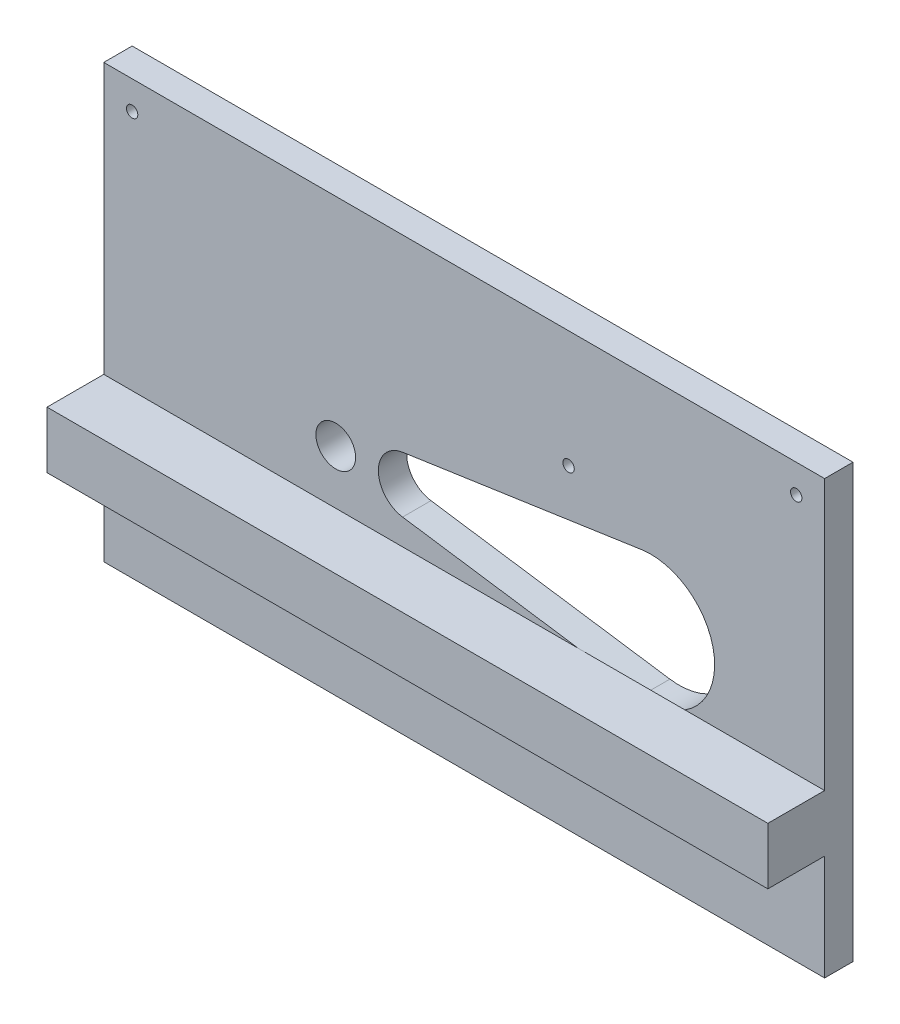
ISO-10303-21;
HEADER;
FILE_DESCRIPTION(('STEP AP214'),'2;1');
FILE_NAME('part.step','',(''),(''),'','','');
FILE_SCHEMA(('AUTOMOTIVE_DESIGN { 1 0 10303 214 1 1 1 1 }'));
ENDSEC;
DATA;
#1=APPLICATION_CONTEXT('core data for automotive mechanical design processes');
#2=APPLICATION_PROTOCOL_DEFINITION('international standard','automotive_design',2000,#1);
#3=PRODUCT_CONTEXT('',#1,'mechanical');
#4=PRODUCT('Part','Part','',(#3));
#5=PRODUCT_RELATED_PRODUCT_CATEGORY('part','',(#4));
#6=PRODUCT_DEFINITION_FORMATION('','',#4);
#7=PRODUCT_DEFINITION_CONTEXT('part definition',#1,'design');
#8=PRODUCT_DEFINITION('design','',#6,#7);
#9=PRODUCT_DEFINITION_SHAPE('','',#8);
#10=(LENGTH_UNIT() NAMED_UNIT(*) SI_UNIT(.MILLI.,.METRE.));
#11=(NAMED_UNIT(*) PLANE_ANGLE_UNIT() SI_UNIT($,.RADIAN.));
#12=(NAMED_UNIT(*) SI_UNIT($,.STERADIAN.) SOLID_ANGLE_UNIT());
#13=UNCERTAINTY_MEASURE_WITH_UNIT(LENGTH_MEASURE(1.E-05),#10,'distance_accuracy_value','');
#14=(GEOMETRIC_REPRESENTATION_CONTEXT(3) GLOBAL_UNCERTAINTY_ASSIGNED_CONTEXT((#13)) GLOBAL_UNIT_ASSIGNED_CONTEXT((#10,
#11,#12)) REPRESENTATION_CONTEXT('',''));
#15=CARTESIAN_POINT('',(0.,0.,0.));
#16=DIRECTION('',(0.,0.,1.));
#17=DIRECTION('',(1.,0.,0.));
#18=AXIS2_PLACEMENT_3D('',#15,#16,#17);
#19=CARTESIAN_POINT('',(0.,0.,10.));
#20=DIRECTION('',(0.,0.,1.));
#21=DIRECTION('',(1.,0.,0.));
#22=AXIS2_PLACEMENT_3D('',#19,#20,#21);
#23=PLANE('',#22);
#24=DIRECTION('',(-1.,0.,0.));
#25=VECTOR('',#24,1.);
#26=CARTESIAN_POINT('',(-125.064497653583,-65.0000000000004,10.));
#27=LINE('',#26,#25);
#28=CARTESIAN_POINT('',(128.935502346417,-65.0000000000004,10.));
#29=VERTEX_POINT('',#28);
#30=CARTESIAN_POINT('',(79.7374731396115,-65.0000000000004,10.));
#31=VERTEX_POINT('',#30);
#32=EDGE_CURVE('E50',#29,#31,#27,.T.);
#33=ORIENTED_EDGE('',*,*,#32,.F.);
#34=DIRECTION('',(0.,-1.,0.));
#35=VECTOR('',#34,1.);
#36=CARTESIAN_POINT('',(128.935502346417,0.,10.));
#37=LINE('',#36,#35);
#38=CARTESIAN_POINT('',(128.935502346417,30.1999999999996,10.));
#39=VERTEX_POINT('',#38);
#40=EDGE_CURVE('E205',#39,#29,#37,.T.);
#41=ORIENTED_EDGE('',*,*,#40,.F.);
#42=DIRECTION('',(1.,0.,0.));
#43=VECTOR('',#42,1.);
#44=CARTESIAN_POINT('',(0.,30.1999999999996,10.));
#45=LINE('',#44,#43);
#46=CARTESIAN_POINT('',(-125.064497653583,30.1999999999996,10.));
#47=VERTEX_POINT('',#46);
#48=EDGE_CURVE('E208',#47,#39,#45,.T.);
#49=ORIENTED_EDGE('',*,*,#48,.F.);
#50=DIRECTION('',(0.,-1.,0.));
#51=VECTOR('',#50,1.);
#52=CARTESIAN_POINT('',(-125.064497653583,0.,10.));
#53=LINE('',#52,#51);
#54=CARTESIAN_POINT('',(-125.064497653583,-65.0000000000004,10.));
#55=VERTEX_POINT('',#54);
#56=EDGE_CURVE('E66',#47,#55,#53,.T.);
#57=ORIENTED_EDGE('',*,*,#56,.T.);
#58=CARTESIAN_POINT('',(42.2173174577816,-65.0000000000004,10.));
#59=VERTEX_POINT('',#58);
#60=EDGE_CURVE('E11',#59,#55,#27,.T.);
#61=ORIENTED_EDGE('',*,*,#60,.F.);
#62=DIRECTION('',(-0.989380470558169,0.145348837209302,0.));
#63=VECTOR('',#62,1.);
#64=CARTESIAN_POINT('',(-8.4554495034443,-57.5557174664701,10.));
#65=LINE('',#64,#63);
#66=CARTESIAN_POINT('',(-19.7679860256755,-55.8938047055821,10.));
#67=VERTEX_POINT('',#66);
#68=EDGE_CURVE('E197',#59,#67,#65,.T.);
#69=ORIENTED_EDGE('',*,*,#68,.T.);
#70=CARTESIAN_POINT('',(-18.3144976535824,-46.0000000000004,10.));
#71=DIRECTION('',(0.,0.,1.));
#72=DIRECTION('',(1.,0.,0.));
#73=AXIS2_PLACEMENT_3D('',#70,#71,#72);
#74=CIRCLE('',#73,10.);
#75=CARTESIAN_POINT('',(-19.7679860256755,-36.1061952944187,10.));
#76=VERTEX_POINT('',#75);
#77=EDGE_CURVE('E186',#76,#67,#74,.T.);
#78=ORIENTED_EDGE('',*,*,#77,.F.);
#79=DIRECTION('',(-0.989380470558169,-0.145348837209302,0.));
#80=VECTOR('',#79,1.);
#81=CARTESIAN_POINT('',(4.77463818425225,-32.5006643615458,10.));
#82=LINE('',#81,#80);
#83=CARTESIAN_POINT('',(64.4151535092082,-23.7389394124416,10.));
#84=VERTEX_POINT('',#83);
#85=EDGE_CURVE('E190',#84,#76,#82,.T.);
#86=ORIENTED_EDGE('',*,*,#85,.F.);
#87=CARTESIAN_POINT('',(67.6855023464175,-46.0000000000004,10.));
#88=DIRECTION('',(0.,0.,1.));
#89=DIRECTION('',(1.,0.,0.));
#90=AXIS2_PLACEMENT_3D('',#87,#88,#89);
#91=CIRCLE('',#90,22.5);
#92=EDGE_CURVE('E193',#31,#84,#91,.T.);
#93=ORIENTED_EDGE('',*,*,#92,.F.);
#94=EDGE_LOOP('',(#33,#41,#49,#57,#61,#69,#78,#86,#93));
#95=FACE_BOUND('',#94,.T.);
#96=CARTESIAN_POINT('',(-115.064497653583,20.1999999999996,10.));
#97=DIRECTION('',(0.,0.,1.));
#98=DIRECTION('',(1.,0.,0.));
#99=AXIS2_PLACEMENT_3D('',#96,#97,#98);
#100=CIRCLE('',#99,2.);
#101=CARTESIAN_POINT('',(-113.064497653583,20.1999999999996,10.));
#102=VERTEX_POINT('',#101);
#103=EDGE_CURVE('E175',#102,#102,#100,.T.);
#104=ORIENTED_EDGE('',*,*,#103,.F.);
#105=EDGE_LOOP('',(#104));
#106=FACE_BOUND('',#105,.T.);
#107=CARTESIAN_POINT('',(118.935502346418,20.1999999999996,10.));
#108=DIRECTION('',(0.,0.,1.));
#109=DIRECTION('',(-1.,0.,0.));
#110=AXIS2_PLACEMENT_3D('',#107,#108,#109);
#111=CIRCLE('',#110,2.);
#112=CARTESIAN_POINT('',(116.935502346418,20.1999999999996,10.));
#113=VERTEX_POINT('',#112);
#114=EDGE_CURVE('E178',#113,#113,#111,.T.);
#115=ORIENTED_EDGE('',*,*,#114,.F.);
#116=EDGE_LOOP('',(#115));
#117=FACE_BOUND('',#116,.T.);
#118=CARTESIAN_POINT('',(38.7255023464175,-11.0000000000004,10.));
#119=DIRECTION('',(0.,0.,1.));
#120=DIRECTION('',(1.,0.,0.));
#121=AXIS2_PLACEMENT_3D('',#118,#119,#120);
#122=CIRCLE('',#121,2.);
#123=CARTESIAN_POINT('',(40.7255023464175,-11.0000000000004,10.));
#124=VERTEX_POINT('',#123);
#125=EDGE_CURVE('E183',#124,#124,#122,.T.);
#126=ORIENTED_EDGE('',*,*,#125,.F.);
#127=EDGE_LOOP('',(#126));
#128=FACE_BOUND('',#127,.T.);
#129=CARTESIAN_POINT('',(-43.3144976535824,-46.0000000000004,10.));
#130=DIRECTION('',(0.,0.,1.));
#131=DIRECTION('',(1.,0.,0.));
#132=AXIS2_PLACEMENT_3D('',#129,#130,#131);
#133=CIRCLE('',#132,7.);
#134=CARTESIAN_POINT('',(-36.3144976535824,-46.0000000000004,10.));
#135=VERTEX_POINT('',#134);
#136=EDGE_CURVE('E201',#135,#135,#133,.T.);
#137=ORIENTED_EDGE('',*,*,#136,.F.);
#138=EDGE_LOOP('',(#137));
#139=FACE_BOUND('',#138,.T.);
#140=ADVANCED_FACE('F39',(#95,#106,#117,#128,#139),#23,.T.);
#141=CARTESIAN_POINT('',(128.935502346417,0.,10.));
#142=DIRECTION('',(1.,0.,0.));
#143=DIRECTION('',(0.,0.,-1.));
#144=AXIS2_PLACEMENT_3D('',#141,#142,#143);
#145=PLANE('',#144);
#146=DIRECTION('',(0.,-1.,0.));
#147=VECTOR('',#146,1.);
#148=CARTESIAN_POINT('',(128.935502346417,0.,0.));
#149=LINE('',#148,#147);
#150=CARTESIAN_POINT('',(128.935502346417,30.1999999999996,0.));
#151=VERTEX_POINT('',#150);
#152=CARTESIAN_POINT('',(128.935502346417,-122.2,0.));
#153=VERTEX_POINT('',#152);
#154=EDGE_CURVE('E236',#151,#153,#149,.T.);
#155=ORIENTED_EDGE('',*,*,#154,.F.);
#156=DIRECTION('',(0.,0.,-1.));
#157=VECTOR('',#156,1.);
#158=CARTESIAN_POINT('',(128.935502346417,30.1999999999996,10.));
#159=LINE('',#158,#157);
#160=EDGE_CURVE('E48',#39,#151,#159,.T.);
#161=ORIENTED_EDGE('',*,*,#160,.F.);
#162=ORIENTED_EDGE('',*,*,#40,.T.);
#163=DIRECTION('',(0.,0.,-1.));
#164=VECTOR('',#163,1.);
#165=CARTESIAN_POINT('',(128.935502346417,-65.0000000000004,30.));
#166=LINE('',#165,#164);
#167=CARTESIAN_POINT('',(128.935502346417,-65.0000000000004,30.));
#168=VERTEX_POINT('',#167);
#169=EDGE_CURVE('E167',#168,#29,#166,.T.);
#170=ORIENTED_EDGE('',*,*,#169,.F.);
#171=DIRECTION('',(0.,1.,0.));
#172=VECTOR('',#171,1.);
#173=CARTESIAN_POINT('',(128.935502346417,-65.0000000000004,30.));
#174=LINE('',#173,#172);
#175=CARTESIAN_POINT('',(128.935502346417,-85.0000000000004,30.));
#176=VERTEX_POINT('',#175);
#177=EDGE_CURVE('E147',#176,#168,#174,.T.);
#178=ORIENTED_EDGE('',*,*,#177,.F.);
#179=DIRECTION('',(0.,0.,-1.));
#180=VECTOR('',#179,1.);
#181=CARTESIAN_POINT('',(128.935502346417,-85.0000000000004,30.));
#182=LINE('',#181,#180);
#183=CARTESIAN_POINT('',(128.935502346417,-85.0000000000004,10.));
#184=VERTEX_POINT('',#183);
#185=EDGE_CURVE('E144',#176,#184,#182,.T.);
#186=ORIENTED_EDGE('',*,*,#185,.T.);
#187=CARTESIAN_POINT('',(128.935502346417,-122.2,10.));
#188=VERTEX_POINT('',#187);
#189=EDGE_CURVE('E204',#184,#188,#37,.T.);
#190=ORIENTED_EDGE('',*,*,#189,.T.);
#191=DIRECTION('',(0.,0.,-1.));
#192=VECTOR('',#191,1.);
#193=CARTESIAN_POINT('',(128.935502346417,-122.2,10.));
#194=LINE('',#193,#192);
#195=EDGE_CURVE('E246',#188,#153,#194,.T.);
#196=ORIENTED_EDGE('',*,*,#195,.T.);
#197=EDGE_LOOP('',(#155,#161,#162,#170,#178,#186,#190,#196));
#198=FACE_BOUND('',#197,.T.);
#199=ADVANCED_FACE('F296',(#198),#145,.T.);
#200=CARTESIAN_POINT('',(0.,30.1999999999996,10.));
#201=DIRECTION('',(0.,1.,0.));
#202=DIRECTION('',(0.,0.,1.));
#203=AXIS2_PLACEMENT_3D('',#200,#201,#202);
#204=PLANE('',#203);
#205=DIRECTION('',(1.,0.,0.));
#206=VECTOR('',#205,1.);
#207=CARTESIAN_POINT('',(0.,30.1999999999996,0.));
#208=LINE('',#207,#206);
#209=CARTESIAN_POINT('',(-125.064497653583,30.1999999999996,0.));
#210=VERTEX_POINT('',#209);
#211=EDGE_CURVE('E239',#210,#151,#208,.T.);
#212=ORIENTED_EDGE('',*,*,#211,.F.);
#213=DIRECTION('',(0.,0.,-1.));
#214=VECTOR('',#213,1.);
#215=CARTESIAN_POINT('',(-125.064497653583,30.1999999999996,10.));
#216=LINE('',#215,#214);
#217=EDGE_CURVE('E251',#47,#210,#216,.T.);
#218=ORIENTED_EDGE('',*,*,#217,.F.);
#219=ORIENTED_EDGE('',*,*,#48,.T.);
#220=ORIENTED_EDGE('',*,*,#160,.T.);
#221=EDGE_LOOP('',(#212,#218,#219,#220));
#222=FACE_BOUND('',#221,.T.);
#223=ADVANCED_FACE('F326',(#222),#204,.T.);
#224=CARTESIAN_POINT('',(-125.064497653583,0.,10.));
#225=DIRECTION('',(1.,0.,0.));
#226=DIRECTION('',(0.,0.,-1.));
#227=AXIS2_PLACEMENT_3D('',#224,#225,#226);
#228=PLANE('',#227);
#229=DIRECTION('',(0.,-1.,0.));
#230=VECTOR('',#229,1.);
#231=CARTESIAN_POINT('',(-125.064497653583,0.,0.));
#232=LINE('',#231,#230);
#233=CARTESIAN_POINT('',(-125.064497653583,-122.2,0.));
#234=VERTEX_POINT('',#233);
#235=EDGE_CURVE('E242',#210,#234,#232,.T.);
#236=ORIENTED_EDGE('',*,*,#235,.T.);
#237=DIRECTION('',(0.,0.,-1.));
#238=VECTOR('',#237,1.);
#239=CARTESIAN_POINT('',(-125.064497653583,-122.2,10.));
#240=LINE('',#239,#238);
#241=CARTESIAN_POINT('',(-125.064497653583,-122.2,10.));
#242=VERTEX_POINT('',#241);
#243=EDGE_CURVE('E248',#242,#234,#240,.T.);
#244=ORIENTED_EDGE('',*,*,#243,.F.);
#245=CARTESIAN_POINT('',(-125.064497653583,-85.0000000000004,10.));
#246=VERTEX_POINT('',#245);
#247=EDGE_CURVE('E161',#246,#242,#53,.T.);
#248=ORIENTED_EDGE('',*,*,#247,.F.);
#249=DIRECTION('',(0.,0.,-1.));
#250=VECTOR('',#249,1.);
#251=CARTESIAN_POINT('',(-125.064497653583,-85.0000000000004,30.));
#252=LINE('',#251,#250);
#253=CARTESIAN_POINT('',(-125.064497653583,-85.0000000000004,30.));
#254=VERTEX_POINT('',#253);
#255=EDGE_CURVE('E142',#254,#246,#252,.T.);
#256=ORIENTED_EDGE('',*,*,#255,.F.);
#257=DIRECTION('',(0.,-1.,0.));
#258=VECTOR('',#257,1.);
#259=CARTESIAN_POINT('',(-125.064497653583,-65.0000000000004,30.));
#260=LINE('',#259,#258);
#261=CARTESIAN_POINT('',(-125.064497653583,-65.0000000000004,30.));
#262=VERTEX_POINT('',#261);
#263=EDGE_CURVE('E148',#262,#254,#260,.T.);
#264=ORIENTED_EDGE('',*,*,#263,.F.);
#265=DIRECTION('',(0.,0.,-1.));
#266=VECTOR('',#265,1.);
#267=CARTESIAN_POINT('',(-125.064497653583,-65.0000000000004,30.));
#268=LINE('',#267,#266);
#269=EDGE_CURVE('E292',#262,#55,#268,.T.);
#270=ORIENTED_EDGE('',*,*,#269,.T.);
#271=ORIENTED_EDGE('',*,*,#56,.F.);
#272=ORIENTED_EDGE('',*,*,#217,.T.);
#273=EDGE_LOOP('',(#236,#244,#248,#256,#264,#270,#271,#272));
#274=FACE_BOUND('',#273,.T.);
#275=ADVANCED_FACE('F159',(#274),#228,.F.);
#276=CARTESIAN_POINT('',(-18.3144976535824,-46.0000000000004,10.));
#277=DIRECTION('',(0.,0.,-1.));
#278=DIRECTION('',(-1.,0.,0.));
#279=AXIS2_PLACEMENT_3D('',#276,#277,#278);
#280=CYLINDRICAL_SURFACE('',#279,10.);
#281=CARTESIAN_POINT('',(-18.3144976535824,-46.0000000000004,0.));
#282=DIRECTION('',(0.,0.,1.));
#283=DIRECTION('',(1.,0.,0.));
#284=AXIS2_PLACEMENT_3D('',#281,#282,#283);
#285=CIRCLE('',#284,10.);
#286=CARTESIAN_POINT('',(-19.7679860256755,-36.1061952944187,0.));
#287=VERTEX_POINT('',#286);
#288=CARTESIAN_POINT('',(-19.7679860256755,-55.8938047055821,0.));
#289=VERTEX_POINT('',#288);
#290=EDGE_CURVE('E221',#287,#289,#285,.T.);
#291=ORIENTED_EDGE('',*,*,#290,.F.);
#292=DIRECTION('',(0.,0.,-1.));
#293=VECTOR('',#292,1.);
#294=CARTESIAN_POINT('',(-19.7679860256755,-36.1061952944187,10.));
#295=LINE('',#294,#293);
#296=EDGE_CURVE('E43',#76,#287,#295,.T.);
#297=ORIENTED_EDGE('',*,*,#296,.F.);
#298=ORIENTED_EDGE('',*,*,#77,.T.);
#299=DIRECTION('',(0.,0.,-1.));
#300=VECTOR('',#299,1.);
#301=CARTESIAN_POINT('',(-19.7679860256755,-55.8938047055821,10.));
#302=LINE('',#301,#300);
#303=EDGE_CURVE('E215',#67,#289,#302,.T.);
#304=ORIENTED_EDGE('',*,*,#303,.T.);
#305=EDGE_LOOP('',(#291,#297,#298,#304));
#306=FACE_BOUND('',#305,.T.);
#307=ADVANCED_FACE('F267',(#306),#280,.F.);
#308=CARTESIAN_POINT('',(4.77463818425225,-32.5006643615458,10.));
#309=DIRECTION('',(0.145348837209302,-0.989380470558169,0.));
#310=DIRECTION('',(0.989380470558169,0.145348837209302,0.));
#311=AXIS2_PLACEMENT_3D('',#308,#309,#310);
#312=PLANE('',#311);
#313=DIRECTION('',(-0.989380470558169,-0.145348837209302,0.));
#314=VECTOR('',#313,1.);
#315=CARTESIAN_POINT('',(4.77463818425225,-32.5006643615458,0.));
#316=LINE('',#315,#314);
#317=CARTESIAN_POINT('',(64.4151535092082,-23.7389394124416,0.));
#318=VERTEX_POINT('',#317);
#319=EDGE_CURVE('E224',#318,#287,#316,.T.);
#320=ORIENTED_EDGE('',*,*,#319,.F.);
#321=DIRECTION('',(0.,0.,-1.));
#322=VECTOR('',#321,1.);
#323=CARTESIAN_POINT('',(64.4151535092082,-23.7389394124416,10.));
#324=LINE('',#323,#322);
#325=EDGE_CURVE('E256',#84,#318,#324,.T.);
#326=ORIENTED_EDGE('',*,*,#325,.F.);
#327=ORIENTED_EDGE('',*,*,#85,.T.);
#328=ORIENTED_EDGE('',*,*,#296,.T.);
#329=EDGE_LOOP('',(#320,#326,#327,#328));
#330=FACE_BOUND('',#329,.T.);
#331=ADVANCED_FACE('F263',(#330),#312,.T.);
#332=CARTESIAN_POINT('',(67.6855023464175,-46.0000000000004,10.));
#333=DIRECTION('',(0.,0.,-1.));
#334=DIRECTION('',(-1.,0.,0.));
#335=AXIS2_PLACEMENT_3D('',#332,#333,#334);
#336=CYLINDRICAL_SURFACE('',#335,22.5);
#337=CARTESIAN_POINT('',(67.6855023464175,-46.0000000000004,0.));
#338=DIRECTION('',(0.,0.,1.));
#339=DIRECTION('',(1.,0.,0.));
#340=AXIS2_PLACEMENT_3D('',#337,#338,#339);
#341=CIRCLE('',#340,22.5);
#342=CARTESIAN_POINT('',(64.4151535092083,-68.2610605875592,0.));
#343=VERTEX_POINT('',#342);
#344=EDGE_CURVE('E227',#343,#318,#341,.T.);
#345=ORIENTED_EDGE('',*,*,#344,.F.);
#346=DIRECTION('',(0.,0.,-1.));
#347=VECTOR('',#346,1.);
#348=CARTESIAN_POINT('',(64.4151535092083,-68.2610605875592,10.));
#349=LINE('',#348,#347);
#350=CARTESIAN_POINT('',(64.4151535092083,-68.2610605875592,10.));
#351=VERTEX_POINT('',#350);
#352=EDGE_CURVE('E255',#351,#343,#349,.T.);
#353=ORIENTED_EDGE('',*,*,#352,.F.);
#354=EDGE_CURVE('E194',#351,#31,#91,.T.);
#355=ORIENTED_EDGE('',*,*,#354,.T.);
#356=ORIENTED_EDGE('',*,*,#92,.T.);
#357=ORIENTED_EDGE('',*,*,#325,.T.);
#358=EDGE_LOOP('',(#345,#353,#355,#356,#357));
#359=FACE_BOUND('',#358,.T.);
#360=ADVANCED_FACE('F273',(#359),#336,.F.);
#361=CARTESIAN_POINT('',(-43.3144976535824,-46.0000000000004,10.));
#362=DIRECTION('',(0.,0.,-1.));
#363=DIRECTION('',(-1.,0.,0.));
#364=AXIS2_PLACEMENT_3D('',#361,#362,#363);
#365=CYLINDRICAL_SURFACE('',#364,7.);
#366=ORIENTED_EDGE('',*,*,#136,.T.);
#367=EDGE_LOOP('',(#366));
#368=FACE_BOUND('',#367,.T.);
#369=CARTESIAN_POINT('',(-43.3144976535824,-46.0000000000004,0.));
#370=DIRECTION('',(0.,0.,1.));
#371=DIRECTION('',(1.,0.,0.));
#372=AXIS2_PLACEMENT_3D('',#369,#370,#371);
#373=CIRCLE('',#372,7.);
#374=CARTESIAN_POINT('',(-36.3144976535824,-46.0000000000004,0.));
#375=VERTEX_POINT('',#374);
#376=EDGE_CURVE('E233',#375,#375,#373,.T.);
#377=ORIENTED_EDGE('',*,*,#376,.F.);
#378=EDGE_LOOP('',(#377));
#379=FACE_BOUND('',#378,.T.);
#380=ADVANCED_FACE('F309',(#368,#379),#365,.F.);
#381=CARTESIAN_POINT('',(-8.4554495034443,-57.5557174664701,10.));
#382=DIRECTION('',(-0.145348837209302,-0.989380470558169,0.));
#383=DIRECTION('',(0.989380470558169,-0.145348837209302,0.));
#384=AXIS2_PLACEMENT_3D('',#381,#382,#383);
#385=PLANE('',#384);
#386=DIRECTION('',(-0.989380470558169,0.145348837209302,0.));
#387=VECTOR('',#386,1.);
#388=CARTESIAN_POINT('',(-8.4554495034443,-57.5557174664701,0.));
#389=LINE('',#388,#387);
#390=EDGE_CURVE('E230',#343,#289,#389,.T.);
#391=ORIENTED_EDGE('',*,*,#390,.T.);
#392=ORIENTED_EDGE('',*,*,#303,.F.);
#393=ORIENTED_EDGE('',*,*,#68,.F.);
#394=EDGE_CURVE('E198',#351,#59,#65,.T.);
#395=ORIENTED_EDGE('',*,*,#394,.F.);
#396=ORIENTED_EDGE('',*,*,#352,.T.);
#397=EDGE_LOOP('',(#391,#392,#393,#395,#396));
#398=FACE_BOUND('',#397,.T.);
#399=ADVANCED_FACE('F279',(#398),#385,.F.);
#400=CARTESIAN_POINT('',(38.7255023464175,-11.0000000000004,10.));
#401=DIRECTION('',(0.,0.,-1.));
#402=DIRECTION('',(-1.,0.,0.));
#403=AXIS2_PLACEMENT_3D('',#400,#401,#402);
#404=CYLINDRICAL_SURFACE('',#403,2.);
#405=ORIENTED_EDGE('',*,*,#125,.T.);
#406=EDGE_LOOP('',(#405));
#407=FACE_BOUND('',#406,.T.);
#408=CARTESIAN_POINT('',(38.7255023464175,-11.0000000000004,0.));
#409=DIRECTION('',(0.,0.,1.));
#410=DIRECTION('',(1.,0.,0.));
#411=AXIS2_PLACEMENT_3D('',#408,#409,#410);
#412=CIRCLE('',#411,2.);
#413=CARTESIAN_POINT('',(40.7255023464175,-11.0000000000004,0.));
#414=VERTEX_POINT('',#413);
#415=EDGE_CURVE('E218',#414,#414,#412,.T.);
#416=ORIENTED_EDGE('',*,*,#415,.F.);
#417=EDGE_LOOP('',(#416));
#418=FACE_BOUND('',#417,.T.);
#419=ADVANCED_FACE('F340',(#407,#418),#404,.F.);
#420=CARTESIAN_POINT('',(38.7255023464175,-81.0000000000004,10.));
#421=DIRECTION('',(0.,0.,-1.));
#422=DIRECTION('',(-1.,0.,0.));
#423=AXIS2_PLACEMENT_3D('',#420,#421,#422);
#424=CYLINDRICAL_SURFACE('',#423,2.00000000000001);
#425=CARTESIAN_POINT('',(38.7255023464175,-81.0000000000004,10.));
#426=DIRECTION('',(0.,0.,1.));
#427=DIRECTION('',(1.,0.,0.));
#428=AXIS2_PLACEMENT_3D('',#425,#426,#427);
#429=CIRCLE('',#428,2.00000000000001);
#430=CARTESIAN_POINT('',(40.7255023464176,-81.0000000000004,10.));
#431=VERTEX_POINT('',#430);
#432=EDGE_CURVE('E162',#431,#431,#429,.T.);
#433=ORIENTED_EDGE('',*,*,#432,.T.);
#434=EDGE_LOOP('',(#433));
#435=FACE_BOUND('',#434,.T.);
#436=CARTESIAN_POINT('',(38.7255023464175,-81.0000000000004,0.));
#437=DIRECTION('',(0.,0.,1.));
#438=DIRECTION('',(1.,0.,0.));
#439=AXIS2_PLACEMENT_3D('',#436,#437,#438);
#440=CIRCLE('',#439,2.00000000000001);
#441=CARTESIAN_POINT('',(40.7255023464176,-81.0000000000004,0.));
#442=VERTEX_POINT('',#441);
#443=EDGE_CURVE('E174',#442,#442,#440,.T.);
#444=ORIENTED_EDGE('',*,*,#443,.F.);
#445=EDGE_LOOP('',(#444));
#446=FACE_BOUND('',#445,.T.);
#447=ADVANCED_FACE('F41',(#435,#446),#424,.F.);
#448=CARTESIAN_POINT('',(0.,-122.2,10.));
#449=DIRECTION('',(0.,1.,0.));
#450=DIRECTION('',(0.,0.,1.));
#451=AXIS2_PLACEMENT_3D('',#448,#449,#450);
#452=PLANE('',#451);
#453=DIRECTION('',(1.,0.,0.));
#454=VECTOR('',#453,1.);
#455=CARTESIAN_POINT('',(0.,-122.2,0.));
#456=LINE('',#455,#454);
#457=EDGE_CURVE('E187',#234,#153,#456,.T.);
#458=ORIENTED_EDGE('',*,*,#457,.T.);
#459=ORIENTED_EDGE('',*,*,#195,.F.);
#460=DIRECTION('',(1.,0.,0.));
#461=VECTOR('',#460,1.);
#462=CARTESIAN_POINT('',(0.,-122.2,10.));
#463=LINE('',#462,#461);
#464=EDGE_CURVE('E212',#242,#188,#463,.T.);
#465=ORIENTED_EDGE('',*,*,#464,.F.);
#466=ORIENTED_EDGE('',*,*,#243,.T.);
#467=EDGE_LOOP('',(#458,#459,#465,#466));
#468=FACE_BOUND('',#467,.T.);
#469=ADVANCED_FACE('F324',(#468),#452,.F.);
#470=DIRECTION('',(1.,0.,0.));
#471=VECTOR('',#470,1.);
#472=CARTESIAN_POINT('',(-125.064497653583,-85.0000000000004,10.));
#473=LINE('',#472,#471);
#474=EDGE_CURVE('E58',#246,#184,#473,.T.);
#475=ORIENTED_EDGE('',*,*,#474,.F.);
#476=ORIENTED_EDGE('',*,*,#247,.T.);
#477=ORIENTED_EDGE('',*,*,#464,.T.);
#478=ORIENTED_EDGE('',*,*,#189,.F.);
#479=EDGE_LOOP('',(#475,#476,#477,#478));
#480=FACE_BOUND('',#479,.T.);
#481=ADVANCED_FACE('F300',(#480),#23,.T.);
#482=CARTESIAN_POINT('',(0.,0.,0.));
#483=DIRECTION('',(0.,0.,1.));
#484=DIRECTION('',(1.,0.,0.));
#485=AXIS2_PLACEMENT_3D('',#482,#483,#484);
#486=PLANE('',#485);
#487=CARTESIAN_POINT('',(-115.064497653583,20.1999999999996,0.));
#488=DIRECTION('',(0.,0.,1.));
#489=DIRECTION('',(1.,0.,0.));
#490=AXIS2_PLACEMENT_3D('',#487,#488,#489);
#491=CIRCLE('',#490,2.);
#492=CARTESIAN_POINT('',(-113.064497653583,20.1999999999996,0.));
#493=VERTEX_POINT('',#492);
#494=EDGE_CURVE('E171',#493,#493,#491,.T.);
#495=ORIENTED_EDGE('',*,*,#494,.T.);
#496=EDGE_LOOP('',(#495));
#497=FACE_BOUND('',#496,.T.);
#498=CARTESIAN_POINT('',(118.935502346418,20.1999999999996,0.));
#499=DIRECTION('',(0.,0.,1.));
#500=DIRECTION('',(-1.,0.,0.));
#501=AXIS2_PLACEMENT_3D('',#498,#499,#500);
#502=CIRCLE('',#501,2.);
#503=CARTESIAN_POINT('',(116.935502346418,20.1999999999996,0.));
#504=VERTEX_POINT('',#503);
#505=EDGE_CURVE('E165',#504,#504,#502,.T.);
#506=ORIENTED_EDGE('',*,*,#505,.T.);
#507=EDGE_LOOP('',(#506));
#508=FACE_BOUND('',#507,.T.);
#509=ORIENTED_EDGE('',*,*,#443,.T.);
#510=EDGE_LOOP('',(#509));
#511=FACE_BOUND('',#510,.T.);
#512=ORIENTED_EDGE('',*,*,#415,.T.);
#513=EDGE_LOOP('',(#512));
#514=FACE_BOUND('',#513,.T.);
#515=ORIENTED_EDGE('',*,*,#290,.T.);
#516=ORIENTED_EDGE('',*,*,#390,.F.);
#517=ORIENTED_EDGE('',*,*,#344,.T.);
#518=ORIENTED_EDGE('',*,*,#319,.T.);
#519=EDGE_LOOP('',(#515,#516,#517,#518));
#520=FACE_BOUND('',#519,.T.);
#521=ORIENTED_EDGE('',*,*,#376,.T.);
#522=EDGE_LOOP('',(#521));
#523=FACE_BOUND('',#522,.T.);
#524=ORIENTED_EDGE('',*,*,#154,.T.);
#525=ORIENTED_EDGE('',*,*,#457,.F.);
#526=ORIENTED_EDGE('',*,*,#235,.F.);
#527=ORIENTED_EDGE('',*,*,#211,.T.);
#528=EDGE_LOOP('',(#524,#525,#526,#527));
#529=FACE_BOUND('',#528,.T.);
#530=ADVANCED_FACE('F271',(#497,#508,#511,#514,#520,#523,#529),#486,.F.);
#531=CARTESIAN_POINT('',(118.935502346418,20.1999999999996,0.));
#532=DIRECTION('',(0.,0.,1.));
#533=DIRECTION('',(1.,0.,0.));
#534=AXIS2_PLACEMENT_3D('',#531,#532,#533);
#535=CYLINDRICAL_SURFACE('',#534,2.);
#536=ORIENTED_EDGE('',*,*,#505,.F.);
#537=EDGE_LOOP('',(#536));
#538=FACE_BOUND('',#537,.T.);
#539=ORIENTED_EDGE('',*,*,#114,.T.);
#540=EDGE_LOOP('',(#539));
#541=FACE_BOUND('',#540,.T.);
#542=ADVANCED_FACE('F316',(#538,#541),#535,.F.);
#543=CARTESIAN_POINT('',(-115.064497653583,20.1999999999996,0.));
#544=DIRECTION('',(0.,0.,1.));
#545=DIRECTION('',(1.,0.,0.));
#546=AXIS2_PLACEMENT_3D('',#543,#544,#545);
#547=CYLINDRICAL_SURFACE('',#546,2.);
#548=ORIENTED_EDGE('',*,*,#494,.F.);
#549=EDGE_LOOP('',(#548));
#550=FACE_BOUND('',#549,.T.);
#551=ORIENTED_EDGE('',*,*,#103,.T.);
#552=EDGE_LOOP('',(#551));
#553=FACE_BOUND('',#552,.T.);
#554=ADVANCED_FACE('F372',(#550,#553),#547,.F.);
#555=CARTESIAN_POINT('',(0.,0.,10.));
#556=DIRECTION('',(0.,0.,1.));
#557=DIRECTION('',(1.,0.,0.));
#558=AXIS2_PLACEMENT_3D('',#555,#556,#557);
#559=PLANE('',#558);
#560=ORIENTED_EDGE('',*,*,#354,.F.);
#561=ORIENTED_EDGE('',*,*,#394,.T.);
#562=EDGE_CURVE('E51',#31,#59,#27,.T.);
#563=ORIENTED_EDGE('',*,*,#562,.F.);
#564=EDGE_LOOP('',(#560,#561,#563));
#565=FACE_BOUND('',#564,.T.);
#566=ADVANCED_FACE('F282',(#565),#559,.F.);
#567=CARTESIAN_POINT('',(0.,0.,30.));
#568=DIRECTION('',(0.,0.,1.));
#569=DIRECTION('',(1.,0.,0.));
#570=AXIS2_PLACEMENT_3D('',#567,#568,#569);
#571=PLANE('',#570);
#572=ORIENTED_EDGE('',*,*,#263,.T.);
#573=DIRECTION('',(1.,0.,0.));
#574=VECTOR('',#573,1.);
#575=CARTESIAN_POINT('',(-125.064497653583,-85.0000000000004,30.));
#576=LINE('',#575,#574);
#577=EDGE_CURVE('E138',#254,#176,#576,.T.);
#578=ORIENTED_EDGE('',*,*,#577,.T.);
#579=ORIENTED_EDGE('',*,*,#177,.T.);
#580=DIRECTION('',(-1.,0.,0.));
#581=VECTOR('',#580,1.);
#582=CARTESIAN_POINT('',(-125.064497653583,-65.0000000000004,30.));
#583=LINE('',#582,#581);
#584=EDGE_CURVE('E153',#168,#262,#583,.T.);
#585=ORIENTED_EDGE('',*,*,#584,.T.);
#586=EDGE_LOOP('',(#572,#578,#579,#585));
#587=FACE_BOUND('',#586,.T.);
#588=ADVANCED_FACE('F151',(#587),#571,.T.);
#589=CARTESIAN_POINT('',(-125.064497653583,-65.0000000000004,30.));
#590=DIRECTION('',(0.,-1.,0.));
#591=DIRECTION('',(0.,0.,-1.));
#592=AXIS2_PLACEMENT_3D('',#589,#590,#591);
#593=PLANE('',#592);
#594=ORIENTED_EDGE('',*,*,#32,.T.);
#595=ORIENTED_EDGE('',*,*,#562,.T.);
#596=ORIENTED_EDGE('',*,*,#60,.T.);
#597=ORIENTED_EDGE('',*,*,#269,.F.);
#598=ORIENTED_EDGE('',*,*,#584,.F.);
#599=ORIENTED_EDGE('',*,*,#169,.T.);
#600=EDGE_LOOP('',(#594,#595,#596,#597,#598,#599));
#601=FACE_BOUND('',#600,.T.);
#602=ADVANCED_FACE('F286',(#601),#593,.F.);
#603=CARTESIAN_POINT('',(-125.064497653583,-85.0000000000004,30.));
#604=DIRECTION('',(0.,1.,0.));
#605=DIRECTION('',(0.,0.,1.));
#606=AXIS2_PLACEMENT_3D('',#603,#604,#605);
#607=PLANE('',#606);
#608=ORIENTED_EDGE('',*,*,#474,.T.);
#609=ORIENTED_EDGE('',*,*,#185,.F.);
#610=ORIENTED_EDGE('',*,*,#577,.F.);
#611=ORIENTED_EDGE('',*,*,#255,.T.);
#612=EDGE_LOOP('',(#608,#609,#610,#611));
#613=FACE_BOUND('',#612,.T.);
#614=ADVANCED_FACE('F140',(#613),#607,.F.);
#615=ORIENTED_EDGE('',*,*,#432,.F.);
#616=EDGE_LOOP('',(#615));
#617=FACE_BOUND('',#616,.T.);
#618=ADVANCED_FACE('F362',(#617),#559,.F.);
#619=CLOSED_SHELL('',(#140,#199,#223,#275,#307,#331,#360,#380,#399,#419,#447,#469,#481,#530,
#542,#554,#566,#588,#602,#614,#618));
#620=MANIFOLD_SOLID_BREP('B2',#619);
#621=ADVANCED_BREP_SHAPE_REPRESENTATION('',(#18,#620),#14);
#622=SHAPE_DEFINITION_REPRESENTATION(#9,#621);
ENDSEC;
END-ISO-10303-21;
